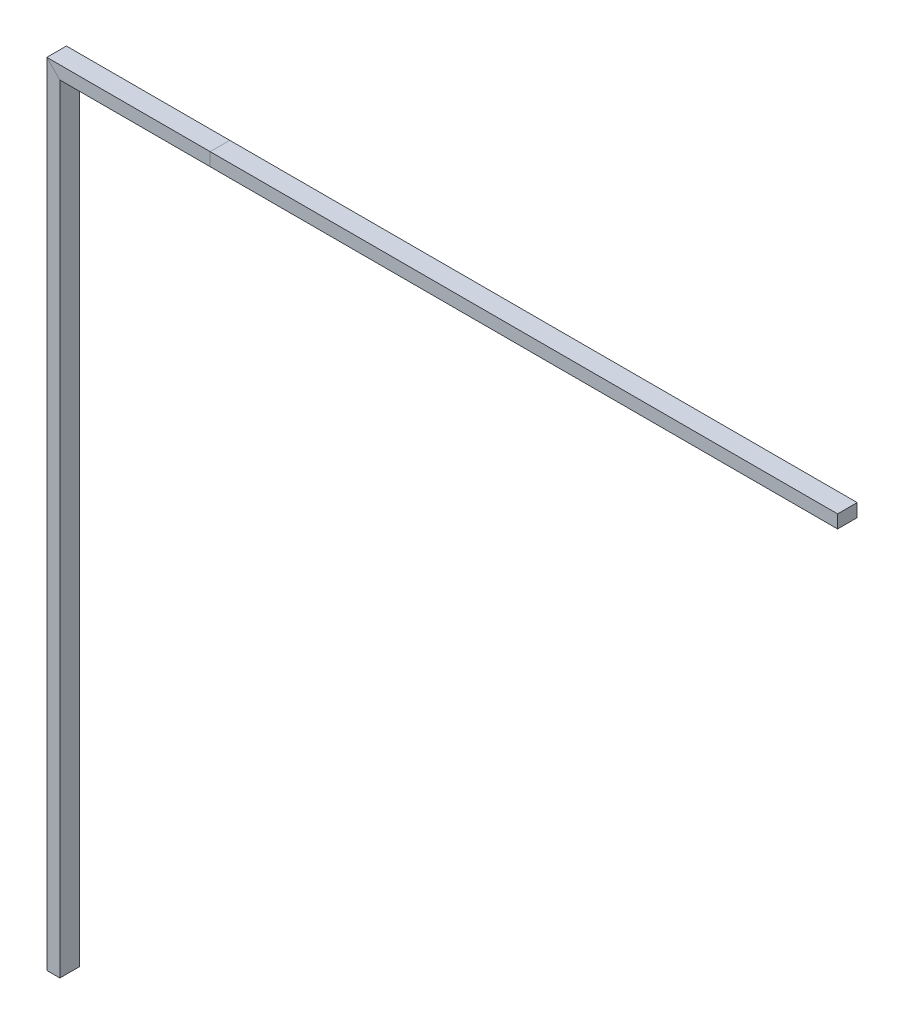
ISO-10303-21;
HEADER;
FILE_DESCRIPTION(('STEP AP214'),'2;1');
FILE_NAME('part.step','',(''),(''),'','','');
FILE_SCHEMA(('AUTOMOTIVE_DESIGN { 1 0 10303 214 1 1 1 1 }'));
ENDSEC;
DATA;
#1=APPLICATION_CONTEXT('core data for automotive mechanical design processes');
#2=APPLICATION_PROTOCOL_DEFINITION('international standard','automotive_design',2000,#1);
#3=PRODUCT_CONTEXT('',#1,'mechanical');
#4=PRODUCT('Part','Part','',(#3));
#5=PRODUCT_RELATED_PRODUCT_CATEGORY('part','',(#4));
#6=PRODUCT_DEFINITION_FORMATION('','',#4);
#7=PRODUCT_DEFINITION_CONTEXT('part definition',#1,'design');
#8=PRODUCT_DEFINITION('design','',#6,#7);
#9=PRODUCT_DEFINITION_SHAPE('','',#8);
#10=(LENGTH_UNIT() NAMED_UNIT(*) SI_UNIT(.MILLI.,.METRE.));
#11=(NAMED_UNIT(*) PLANE_ANGLE_UNIT() SI_UNIT($,.RADIAN.));
#12=(NAMED_UNIT(*) SI_UNIT($,.STERADIAN.) SOLID_ANGLE_UNIT());
#13=UNCERTAINTY_MEASURE_WITH_UNIT(LENGTH_MEASURE(1.E-05),#10,'distance_accuracy_value','');
#14=(GEOMETRIC_REPRESENTATION_CONTEXT(3) GLOBAL_UNCERTAINTY_ASSIGNED_CONTEXT((#13)) GLOBAL_UNIT_ASSIGNED_CONTEXT((#10,
#11,#12)) REPRESENTATION_CONTEXT('',''));
#15=CARTESIAN_POINT('',(0.,0.,0.));
#16=DIRECTION('',(0.,0.,1.));
#17=DIRECTION('',(1.,0.,0.));
#18=AXIS2_PLACEMENT_3D('',#15,#16,#17);
#19=CARTESIAN_POINT('',(-9.99999999999997,1200.,-14.9999999999999));
#20=DIRECTION('',(0.,0.,1.));
#21=DIRECTION('',(1.,0.,0.));
#22=AXIS2_PLACEMENT_3D('',#19,#20,#21);
#23=PLANE('',#22);
#24=DIRECTION('',(-0.707106781186548,0.707106781186547,0.));
#25=VECTOR('',#24,1.);
#26=CARTESIAN_POINT('',(-4.99999999999998,1205.,-14.9999999999999));
#27=LINE('',#26,#25);
#28=CARTESIAN_POINT('',(10.,1190.,-14.9999999999999));
#29=VERTEX_POINT('',#28);
#30=CARTESIAN_POINT('',(-9.99999999999997,1210.,-14.9999999999999));
#31=VERTEX_POINT('',#30);
#32=EDGE_CURVE('E127',#29,#31,#27,.T.);
#33=ORIENTED_EDGE('',*,*,#32,.F.);
#34=DIRECTION('',(0.,-1.,0.));
#35=VECTOR('',#34,1.);
#36=CARTESIAN_POINT('',(10.,1200.,-14.9999999999999));
#37=LINE('',#36,#35);
#38=CARTESIAN_POINT('',(10.,0.,-14.9999999999999));
#39=VERTEX_POINT('',#38);
#40=EDGE_CURVE('E81',#29,#39,#37,.T.);
#41=ORIENTED_EDGE('',*,*,#40,.T.);
#42=DIRECTION('',(-1.,0.,0.));
#43=VECTOR('',#42,1.);
#44=CARTESIAN_POINT('',(-9.99999999999997,0.,-14.9999999999999));
#45=LINE('',#44,#43);
#46=CARTESIAN_POINT('',(-9.99999999999997,0.,-14.9999999999999));
#47=VERTEX_POINT('',#46);
#48=EDGE_CURVE('E125',#39,#47,#45,.T.);
#49=ORIENTED_EDGE('',*,*,#48,.T.);
#50=DIRECTION('',(0.,-1.,0.));
#51=VECTOR('',#50,1.);
#52=CARTESIAN_POINT('',(-9.99999999999997,1200.,-14.9999999999999));
#53=LINE('',#52,#51);
#54=EDGE_CURVE('E116',#31,#47,#53,.T.);
#55=ORIENTED_EDGE('',*,*,#54,.F.);
#56=EDGE_LOOP('',(#33,#41,#49,#55));
#57=FACE_BOUND('',#56,.T.);
#58=ADVANCED_FACE('F77',(#57),#23,.F.);
#59=CARTESIAN_POINT('',(-9.99999999999991,1200.,14.9999999999999));
#60=DIRECTION('',(1.,0.,0.));
#61=DIRECTION('',(0.,0.,-1.));
#62=AXIS2_PLACEMENT_3D('',#59,#60,#61);
#63=PLANE('',#62);
#64=DIRECTION('',(0.,0.,1.));
#65=VECTOR('',#64,1.);
#66=CARTESIAN_POINT('',(-9.99999999999991,1210.,14.9999999999999));
#67=LINE('',#66,#65);
#68=CARTESIAN_POINT('',(-9.9999999999999,1210.,14.9999999999999));
#69=VERTEX_POINT('',#68);
#70=EDGE_CURVE('E86',#31,#69,#67,.T.);
#71=ORIENTED_EDGE('',*,*,#70,.F.);
#72=ORIENTED_EDGE('',*,*,#54,.T.);
#73=DIRECTION('',(0.,0.,1.));
#74=VECTOR('',#73,1.);
#75=CARTESIAN_POINT('',(-9.99999999999991,0.,14.9999999999999));
#76=LINE('',#75,#74);
#77=CARTESIAN_POINT('',(-9.99999999999991,0.,14.9999999999999));
#78=VERTEX_POINT('',#77);
#79=EDGE_CURVE('E137',#47,#78,#76,.T.);
#80=ORIENTED_EDGE('',*,*,#79,.T.);
#81=DIRECTION('',(0.,-1.,0.));
#82=VECTOR('',#81,1.);
#83=CARTESIAN_POINT('',(-9.99999999999991,1200.,14.9999999999999));
#84=LINE('',#83,#82);
#85=EDGE_CURVE('E146',#69,#78,#84,.T.);
#86=ORIENTED_EDGE('',*,*,#85,.F.);
#87=EDGE_LOOP('',(#71,#72,#80,#86));
#88=FACE_BOUND('',#87,.T.);
#89=ADVANCED_FACE('F150',(#88),#63,.F.);
#90=CARTESIAN_POINT('',(-9.99999999999991,1200.,14.9999999999999));
#91=DIRECTION('',(0.,0.,-1.));
#92=DIRECTION('',(-1.,0.,0.));
#93=AXIS2_PLACEMENT_3D('',#90,#91,#92);
#94=PLANE('',#93);
#95=DIRECTION('',(0.707106781186548,-0.707106781186547,0.));
#96=VECTOR('',#95,1.);
#97=CARTESIAN_POINT('',(-4.99999999999996,1205.,14.9999999999999));
#98=LINE('',#97,#96);
#99=CARTESIAN_POINT('',(10.0000000000001,1190.,14.9999999999999));
#100=VERTEX_POINT('',#99);
#101=EDGE_CURVE('E13',#69,#100,#98,.T.);
#102=ORIENTED_EDGE('',*,*,#101,.F.);
#103=ORIENTED_EDGE('',*,*,#85,.T.);
#104=DIRECTION('',(1.,0.,0.));
#105=VECTOR('',#104,1.);
#106=CARTESIAN_POINT('',(-9.99999999999991,0.,14.9999999999999));
#107=LINE('',#106,#105);
#108=CARTESIAN_POINT('',(10.0000000000001,0.,14.9999999999999));
#109=VERTEX_POINT('',#108);
#110=EDGE_CURVE('E147',#78,#109,#107,.T.);
#111=ORIENTED_EDGE('',*,*,#110,.T.);
#112=DIRECTION('',(0.,-1.,0.));
#113=VECTOR('',#112,1.);
#114=CARTESIAN_POINT('',(10.0000000000001,1200.,14.9999999999999));
#115=LINE('',#114,#113);
#116=EDGE_CURVE('E99',#100,#109,#115,.T.);
#117=ORIENTED_EDGE('',*,*,#116,.F.);
#118=EDGE_LOOP('',(#102,#103,#111,#117));
#119=FACE_BOUND('',#118,.T.);
#120=ADVANCED_FACE('F149',(#119),#94,.F.);
#121=CARTESIAN_POINT('',(10.0000000000001,1200.,14.9999999999999));
#122=DIRECTION('',(-1.,0.,0.));
#123=DIRECTION('',(0.,0.,1.));
#124=AXIS2_PLACEMENT_3D('',#121,#122,#123);
#125=PLANE('',#124);
#126=DIRECTION('',(0.,0.,-1.));
#127=VECTOR('',#126,1.);
#128=CARTESIAN_POINT('',(10.0000000000001,1190.,14.9999999999999));
#129=LINE('',#128,#127);
#130=EDGE_CURVE('E134',#100,#29,#129,.T.);
#131=ORIENTED_EDGE('',*,*,#130,.F.);
#132=ORIENTED_EDGE('',*,*,#116,.T.);
#133=DIRECTION('',(0.,0.,-1.));
#134=VECTOR('',#133,1.);
#135=CARTESIAN_POINT('',(10.0000000000001,0.,14.9999999999999));
#136=LINE('',#135,#134);
#137=EDGE_CURVE('E130',#109,#39,#136,.T.);
#138=ORIENTED_EDGE('',*,*,#137,.T.);
#139=ORIENTED_EDGE('',*,*,#40,.F.);
#140=EDGE_LOOP('',(#131,#132,#138,#139));
#141=FACE_BOUND('',#140,.T.);
#142=ADVANCED_FACE('F131',(#141),#125,.F.);
#143=CARTESIAN_POINT('',(10.,0.,-14.9999999999999));
#144=DIRECTION('',(0.,1.,0.));
#145=DIRECTION('',(-1.,0.,0.));
#146=AXIS2_PLACEMENT_3D('',#143,#144,#145);
#147=PLANE('',#146);
#148=ORIENTED_EDGE('',*,*,#48,.F.);
#149=ORIENTED_EDGE('',*,*,#137,.F.);
#150=ORIENTED_EDGE('',*,*,#110,.F.);
#151=ORIENTED_EDGE('',*,*,#79,.F.);
#152=EDGE_LOOP('',(#148,#149,#150,#151));
#153=FACE_BOUND('',#152,.T.);
#154=ADVANCED_FACE('F136',(#153),#147,.F.);
#155=CARTESIAN_POINT('',(0.,1200.,0.));
#156=DIRECTION('',(0.707106781186547,0.707106781186548,0.));
#157=DIRECTION('',(-0.707106781186548,0.707106781186547,0.));
#158=AXIS2_PLACEMENT_3D('',#155,#156,#157);
#159=PLANE('',#158);
#160=ORIENTED_EDGE('',*,*,#130,.T.);
#161=ORIENTED_EDGE('',*,*,#32,.T.);
#162=ORIENTED_EDGE('',*,*,#70,.T.);
#163=ORIENTED_EDGE('',*,*,#101,.T.);
#164=EDGE_LOOP('',(#160,#161,#162,#163));
#165=FACE_BOUND('',#164,.T.);
#166=ADVANCED_FACE('F79',(#165),#159,.T.);
#167=CLOSED_SHELL('',(#58,#89,#120,#142,#154,#166));
#168=MANIFOLD_SOLID_BREP('B2',#167);
#169=CARTESIAN_POINT('',(240.,1210.,-14.9999999999999));
#170=DIRECTION('',(0.,0.,1.));
#171=DIRECTION('',(0.,-1.,0.));
#172=AXIS2_PLACEMENT_3D('',#169,#170,#171);
#173=PLANE('',#172);
#174=DIRECTION('',(0.707106781186547,-0.707106781186548,0.));
#175=VECTOR('',#174,1.);
#176=CARTESIAN_POINT('',(115.,1085.,-15.0000000000001));
#177=LINE('',#176,#175);
#178=CARTESIAN_POINT('',(-10.,1210.,-14.9999999999999));
#179=VERTEX_POINT('',#178);
#180=CARTESIAN_POINT('',(9.99999999999998,1190.,-14.9999999999999));
#181=VERTEX_POINT('',#180);
#182=EDGE_CURVE('E289',#179,#181,#177,.T.);
#183=ORIENTED_EDGE('',*,*,#182,.F.);
#184=DIRECTION('',(-1.,0.,0.));
#185=VECTOR('',#184,1.);
#186=CARTESIAN_POINT('',(240.,1210.,-14.9999999999999));
#187=LINE('',#186,#185);
#188=CARTESIAN_POINT('',(240.,1210.,-14.9999999999999));
#189=VERTEX_POINT('',#188);
#190=EDGE_CURVE('E290',#189,#179,#187,.T.);
#191=ORIENTED_EDGE('',*,*,#190,.F.);
#192=DIRECTION('',(0.,1.,0.));
#193=VECTOR('',#192,1.);
#194=CARTESIAN_POINT('',(240.,1210.,-14.9999999999999));
#195=LINE('',#194,#193);
#196=CARTESIAN_POINT('',(240.,1190.,-14.9999999999999));
#197=VERTEX_POINT('',#196);
#198=EDGE_CURVE('E305',#197,#189,#195,.T.);
#199=ORIENTED_EDGE('',*,*,#198,.F.);
#200=DIRECTION('',(-1.,0.,0.));
#201=VECTOR('',#200,1.);
#202=CARTESIAN_POINT('',(240.,1190.,-14.9999999999999));
#203=LINE('',#202,#201);
#204=EDGE_CURVE('E244',#197,#181,#203,.T.);
#205=ORIENTED_EDGE('',*,*,#204,.T.);
#206=EDGE_LOOP('',(#183,#191,#199,#205));
#207=FACE_BOUND('',#206,.T.);
#208=ADVANCED_FACE('F240',(#207),#173,.F.);
#209=CARTESIAN_POINT('',(240.,1210.,14.9999999999999));
#210=DIRECTION('',(0.,-1.,0.));
#211=DIRECTION('',(0.,0.,-1.));
#212=AXIS2_PLACEMENT_3D('',#209,#210,#211);
#213=PLANE('',#212);
#214=DIRECTION('',(0.,0.,-1.));
#215=VECTOR('',#214,1.);
#216=CARTESIAN_POINT('',(-10.,1210.,15.0000000000004));
#217=LINE('',#216,#215);
#218=CARTESIAN_POINT('',(-10.,1210.,14.9999999999999));
#219=VERTEX_POINT('',#218);
#220=EDGE_CURVE('E278',#219,#179,#217,.T.);
#221=ORIENTED_EDGE('',*,*,#220,.F.);
#222=DIRECTION('',(-1.,0.,0.));
#223=VECTOR('',#222,1.);
#224=CARTESIAN_POINT('',(240.,1210.,14.9999999999999));
#225=LINE('',#224,#223);
#226=CARTESIAN_POINT('',(240.,1210.,14.9999999999999));
#227=VERTEX_POINT('',#226);
#228=EDGE_CURVE('E295',#227,#219,#225,.T.);
#229=ORIENTED_EDGE('',*,*,#228,.F.);
#230=DIRECTION('',(0.,0.,1.));
#231=VECTOR('',#230,1.);
#232=CARTESIAN_POINT('',(240.,1210.,14.9999999999999));
#233=LINE('',#232,#231);
#234=EDGE_CURVE('E273',#189,#227,#233,.T.);
#235=ORIENTED_EDGE('',*,*,#234,.F.);
#236=ORIENTED_EDGE('',*,*,#190,.T.);
#237=EDGE_LOOP('',(#221,#229,#235,#236));
#238=FACE_BOUND('',#237,.T.);
#239=ADVANCED_FACE('F294',(#238),#213,.F.);
#240=CARTESIAN_POINT('',(240.,1210.,14.9999999999999));
#241=DIRECTION('',(0.,0.,-1.));
#242=DIRECTION('',(0.,1.,0.));
#243=AXIS2_PLACEMENT_3D('',#240,#241,#242);
#244=PLANE('',#243);
#245=DIRECTION('',(-0.707106781186547,0.707106781186548,0.));
#246=VECTOR('',#245,1.);
#247=CARTESIAN_POINT('',(115.,1085.,14.9999999999997));
#248=LINE('',#247,#246);
#249=CARTESIAN_POINT('',(10.,1190.,14.9999999999999));
#250=VERTEX_POINT('',#249);
#251=EDGE_CURVE('E75',#250,#219,#248,.T.);
#252=ORIENTED_EDGE('',*,*,#251,.F.);
#253=DIRECTION('',(-1.,0.,0.));
#254=VECTOR('',#253,1.);
#255=CARTESIAN_POINT('',(240.,1190.,14.9999999999999));
#256=LINE('',#255,#254);
#257=CARTESIAN_POINT('',(240.,1190.,14.9999999999999));
#258=VERTEX_POINT('',#257);
#259=EDGE_CURVE('E304',#258,#250,#256,.T.);
#260=ORIENTED_EDGE('',*,*,#259,.F.);
#261=DIRECTION('',(0.,-1.,0.));
#262=VECTOR('',#261,1.);
#263=CARTESIAN_POINT('',(240.,1210.,14.9999999999999));
#264=LINE('',#263,#262);
#265=EDGE_CURVE('E299',#227,#258,#264,.T.);
#266=ORIENTED_EDGE('',*,*,#265,.F.);
#267=ORIENTED_EDGE('',*,*,#228,.T.);
#268=EDGE_LOOP('',(#252,#260,#266,#267));
#269=FACE_BOUND('',#268,.T.);
#270=ADVANCED_FACE('F313',(#269),#244,.F.);
#271=CARTESIAN_POINT('',(240.,1190.,14.9999999999999));
#272=DIRECTION('',(0.,1.,0.));
#273=DIRECTION('',(0.,0.,1.));
#274=AXIS2_PLACEMENT_3D('',#271,#272,#273);
#275=PLANE('',#274);
#276=DIRECTION('',(0.,0.,1.));
#277=VECTOR('',#276,1.);
#278=CARTESIAN_POINT('',(10.,1190.,15.0000000000003));
#279=LINE('',#278,#277);
#280=EDGE_CURVE('E250',#181,#250,#279,.T.);
#281=ORIENTED_EDGE('',*,*,#280,.F.);
#282=ORIENTED_EDGE('',*,*,#204,.F.);
#283=DIRECTION('',(0.,0.,-1.));
#284=VECTOR('',#283,1.);
#285=CARTESIAN_POINT('',(240.,1190.,14.9999999999999));
#286=LINE('',#285,#284);
#287=EDGE_CURVE('E259',#258,#197,#286,.T.);
#288=ORIENTED_EDGE('',*,*,#287,.F.);
#289=ORIENTED_EDGE('',*,*,#259,.T.);
#290=EDGE_LOOP('',(#281,#282,#288,#289));
#291=FACE_BOUND('',#290,.T.);
#292=ADVANCED_FACE('F314',(#291),#275,.F.);
#293=CARTESIAN_POINT('',(240.,1190.,-14.9999999999999));
#294=DIRECTION('',(1.,0.,0.));
#295=DIRECTION('',(0.,1.,0.));
#296=AXIS2_PLACEMENT_3D('',#293,#294,#295);
#297=PLANE('',#296);
#298=ORIENTED_EDGE('',*,*,#198,.T.);
#299=ORIENTED_EDGE('',*,*,#234,.T.);
#300=ORIENTED_EDGE('',*,*,#265,.T.);
#301=ORIENTED_EDGE('',*,*,#287,.T.);
#302=EDGE_LOOP('',(#298,#299,#300,#301));
#303=FACE_BOUND('',#302,.T.);
#304=ADVANCED_FACE('F311',(#303),#297,.T.);
#305=CARTESIAN_POINT('',(0.,1200.,0.));
#306=DIRECTION('',(-0.707106781186548,-0.707106781186547,0.));
#307=DIRECTION('',(0.707106781186547,-0.707106781186548,0.));
#308=AXIS2_PLACEMENT_3D('',#305,#306,#307);
#309=PLANE('',#308);
#310=ORIENTED_EDGE('',*,*,#220,.T.);
#311=ORIENTED_EDGE('',*,*,#182,.T.);
#312=ORIENTED_EDGE('',*,*,#280,.T.);
#313=ORIENTED_EDGE('',*,*,#251,.T.);
#314=EDGE_LOOP('',(#310,#311,#312,#313));
#315=FACE_BOUND('',#314,.T.);
#316=ADVANCED_FACE('F242',(#315),#309,.T.);
#317=CLOSED_SHELL('',(#208,#239,#270,#292,#304,#316));
#318=MANIFOLD_SOLID_BREP('B7',#317);
#319=CARTESIAN_POINT('',(1200.,1210.,-14.9999999999999));
#320=DIRECTION('',(0.,0.,1.));
#321=DIRECTION('',(0.,-1.,0.));
#322=AXIS2_PLACEMENT_3D('',#319,#320,#321);
#323=PLANE('',#322);
#324=DIRECTION('',(0.,1.,0.));
#325=VECTOR('',#324,1.);
#326=CARTESIAN_POINT('',(240.,1210.,-14.9999999999999));
#327=LINE('',#326,#325);
#328=CARTESIAN_POINT('',(240.,1190.,-14.9999999999999));
#329=VERTEX_POINT('',#328);
#330=CARTESIAN_POINT('',(240.,1210.,-14.9999999999999));
#331=VERTEX_POINT('',#330);
#332=EDGE_CURVE('E457',#329,#331,#327,.T.);
#333=ORIENTED_EDGE('',*,*,#332,.T.);
#334=DIRECTION('',(-1.,0.,0.));
#335=VECTOR('',#334,1.);
#336=CARTESIAN_POINT('',(1200.,1210.,-14.9999999999999));
#337=LINE('',#336,#335);
#338=CARTESIAN_POINT('',(1200.,1210.,-14.9999999999999));
#339=VERTEX_POINT('',#338);
#340=EDGE_CURVE('E238',#339,#331,#337,.T.);
#341=ORIENTED_EDGE('',*,*,#340,.F.);
#342=DIRECTION('',(0.,1.,0.));
#343=VECTOR('',#342,1.);
#344=CARTESIAN_POINT('',(1200.,1210.,-14.9999999999999));
#345=LINE('',#344,#343);
#346=CARTESIAN_POINT('',(1200.,1190.,-14.9999999999999));
#347=VERTEX_POINT('',#346);
#348=EDGE_CURVE('E445',#347,#339,#345,.T.);
#349=ORIENTED_EDGE('',*,*,#348,.F.);
#350=DIRECTION('',(-1.,0.,0.));
#351=VECTOR('',#350,1.);
#352=CARTESIAN_POINT('',(1200.,1190.,-14.9999999999999));
#353=LINE('',#352,#351);
#354=EDGE_CURVE('E453',#347,#329,#353,.T.);
#355=ORIENTED_EDGE('',*,*,#354,.T.);
#356=EDGE_LOOP('',(#333,#341,#349,#355));
#357=FACE_BOUND('',#356,.T.);
#358=ADVANCED_FACE('F394',(#357),#323,.F.);
#359=CARTESIAN_POINT('',(1200.,1210.,14.9999999999999));
#360=DIRECTION('',(0.,-1.,0.));
#361=DIRECTION('',(0.,0.,-1.));
#362=AXIS2_PLACEMENT_3D('',#359,#360,#361);
#363=PLANE('',#362);
#364=DIRECTION('',(0.,0.,1.));
#365=VECTOR('',#364,1.);
#366=CARTESIAN_POINT('',(240.,1210.,14.9999999999999));
#367=LINE('',#366,#365);
#368=CARTESIAN_POINT('',(240.,1210.,14.9999999999999));
#369=VERTEX_POINT('',#368);
#370=EDGE_CURVE('E449',#331,#369,#367,.T.);
#371=ORIENTED_EDGE('',*,*,#370,.T.);
#372=DIRECTION('',(-1.,0.,0.));
#373=VECTOR('',#372,1.);
#374=CARTESIAN_POINT('',(1200.,1210.,14.9999999999999));
#375=LINE('',#374,#373);
#376=CARTESIAN_POINT('',(1200.,1210.,14.9999999999999));
#377=VERTEX_POINT('',#376);
#378=EDGE_CURVE('E402',#377,#369,#375,.T.);
#379=ORIENTED_EDGE('',*,*,#378,.F.);
#380=DIRECTION('',(0.,0.,1.));
#381=VECTOR('',#380,1.);
#382=CARTESIAN_POINT('',(1200.,1210.,14.9999999999999));
#383=LINE('',#382,#381);
#384=EDGE_CURVE('E440',#339,#377,#383,.T.);
#385=ORIENTED_EDGE('',*,*,#384,.F.);
#386=ORIENTED_EDGE('',*,*,#340,.T.);
#387=EDGE_LOOP('',(#371,#379,#385,#386));
#388=FACE_BOUND('',#387,.T.);
#389=ADVANCED_FACE('F448',(#388),#363,.F.);
#390=CARTESIAN_POINT('',(1200.,1210.,14.9999999999999));
#391=DIRECTION('',(0.,0.,-1.));
#392=DIRECTION('',(0.,1.,0.));
#393=AXIS2_PLACEMENT_3D('',#390,#391,#392);
#394=PLANE('',#393);
#395=DIRECTION('',(0.,-1.,0.));
#396=VECTOR('',#395,1.);
#397=CARTESIAN_POINT('',(240.,1210.,14.9999999999999));
#398=LINE('',#397,#396);
#399=CARTESIAN_POINT('',(240.,1190.,14.9999999999999));
#400=VERTEX_POINT('',#399);
#401=EDGE_CURVE('E427',#369,#400,#398,.T.);
#402=ORIENTED_EDGE('',*,*,#401,.T.);
#403=DIRECTION('',(-1.,0.,0.));
#404=VECTOR('',#403,1.);
#405=CARTESIAN_POINT('',(1200.,1190.,14.9999999999999));
#406=LINE('',#405,#404);
#407=CARTESIAN_POINT('',(1200.,1190.,14.9999999999999));
#408=VERTEX_POINT('',#407);
#409=EDGE_CURVE('E450',#408,#400,#406,.T.);
#410=ORIENTED_EDGE('',*,*,#409,.F.);
#411=DIRECTION('',(0.,-1.,0.));
#412=VECTOR('',#411,1.);
#413=CARTESIAN_POINT('',(1200.,1210.,14.9999999999999));
#414=LINE('',#413,#412);
#415=EDGE_CURVE('E443',#377,#408,#414,.T.);
#416=ORIENTED_EDGE('',*,*,#415,.F.);
#417=ORIENTED_EDGE('',*,*,#378,.T.);
#418=EDGE_LOOP('',(#402,#410,#416,#417));
#419=FACE_BOUND('',#418,.T.);
#420=ADVANCED_FACE('F451',(#419),#394,.F.);
#421=CARTESIAN_POINT('',(1200.,1190.,14.9999999999999));
#422=DIRECTION('',(0.,1.,0.));
#423=DIRECTION('',(0.,0.,1.));
#424=AXIS2_PLACEMENT_3D('',#421,#422,#423);
#425=PLANE('',#424);
#426=DIRECTION('',(0.,0.,-1.));
#427=VECTOR('',#426,1.);
#428=CARTESIAN_POINT('',(240.,1190.,14.9999999999999));
#429=LINE('',#428,#427);
#430=EDGE_CURVE('E433',#400,#329,#429,.T.);
#431=ORIENTED_EDGE('',*,*,#430,.T.);
#432=ORIENTED_EDGE('',*,*,#354,.F.);
#433=DIRECTION('',(0.,0.,-1.));
#434=VECTOR('',#433,1.);
#435=CARTESIAN_POINT('',(1200.,1190.,14.9999999999999));
#436=LINE('',#435,#434);
#437=EDGE_CURVE('E410',#408,#347,#436,.T.);
#438=ORIENTED_EDGE('',*,*,#437,.F.);
#439=ORIENTED_EDGE('',*,*,#409,.T.);
#440=EDGE_LOOP('',(#431,#432,#438,#439));
#441=FACE_BOUND('',#440,.T.);
#442=ADVANCED_FACE('F464',(#441),#425,.F.);
#443=CARTESIAN_POINT('',(1200.,1190.,-14.9999999999999));
#444=DIRECTION('',(1.,0.,0.));
#445=DIRECTION('',(0.,1.,0.));
#446=AXIS2_PLACEMENT_3D('',#443,#444,#445);
#447=PLANE('',#446);
#448=ORIENTED_EDGE('',*,*,#348,.T.);
#449=ORIENTED_EDGE('',*,*,#384,.T.);
#450=ORIENTED_EDGE('',*,*,#415,.T.);
#451=ORIENTED_EDGE('',*,*,#437,.T.);
#452=EDGE_LOOP('',(#448,#449,#450,#451));
#453=FACE_BOUND('',#452,.T.);
#454=ADVANCED_FACE('F441',(#453),#447,.T.);
#455=CARTESIAN_POINT('',(240.,1190.,-14.9999999999999));
#456=DIRECTION('',(1.,0.,0.));
#457=DIRECTION('',(0.,1.,0.));
#458=AXIS2_PLACEMENT_3D('',#455,#456,#457);
#459=PLANE('',#458);
#460=ORIENTED_EDGE('',*,*,#332,.F.);
#461=ORIENTED_EDGE('',*,*,#430,.F.);
#462=ORIENTED_EDGE('',*,*,#401,.F.);
#463=ORIENTED_EDGE('',*,*,#370,.F.);
#464=EDGE_LOOP('',(#460,#461,#462,#463));
#465=FACE_BOUND('',#464,.T.);
#466=ADVANCED_FACE('F467',(#465),#459,.F.);
#467=CLOSED_SHELL('',(#358,#389,#420,#442,#454,#466));
#468=MANIFOLD_SOLID_BREP('B69',#467);
#469=ADVANCED_BREP_SHAPE_REPRESENTATION('',(#18,#168,#318,#468),#14);
#470=SHAPE_DEFINITION_REPRESENTATION(#9,#469);
ENDSEC;
END-ISO-10303-21;
